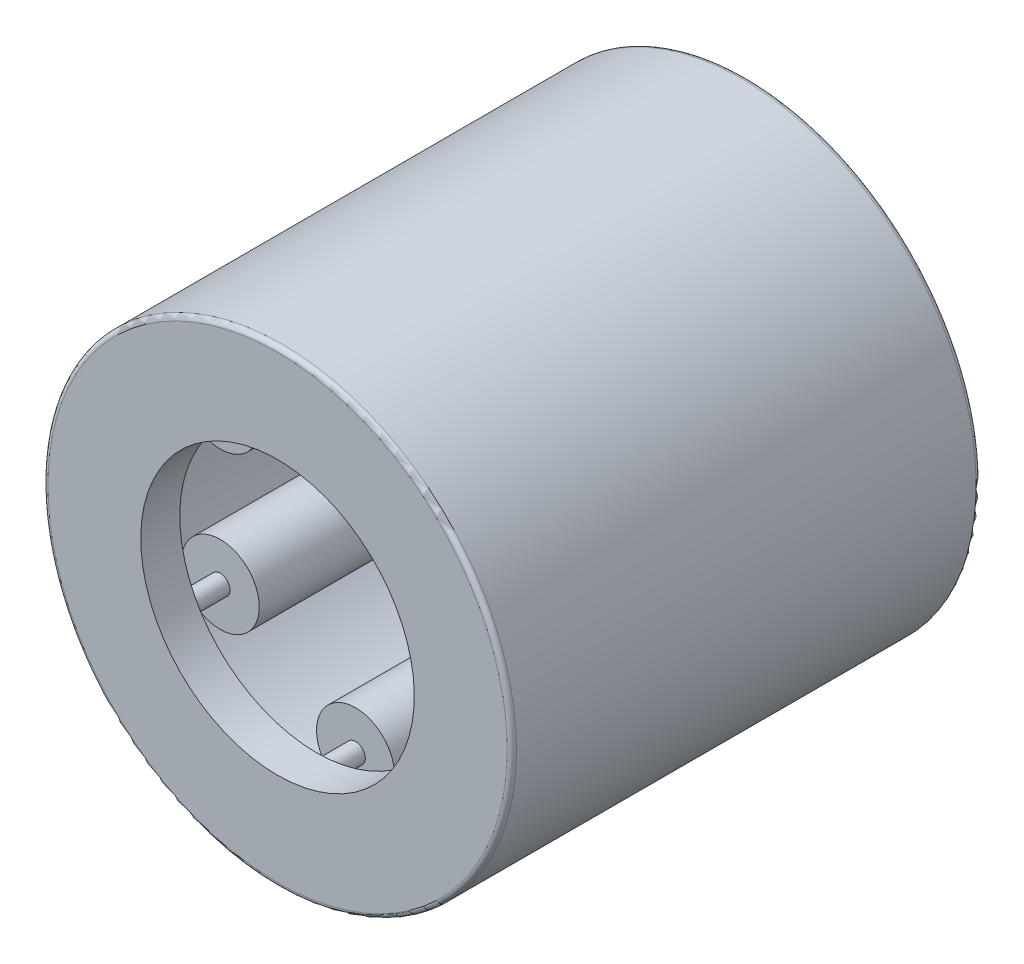
ISO-10303-21;
HEADER;
FILE_DESCRIPTION(('STEP AP214'),'2;1');
FILE_NAME('part.step','',(''),(''),'','','');
FILE_SCHEMA(('AUTOMOTIVE_DESIGN { 1 0 10303 214 1 1 1 1 }'));
ENDSEC;
DATA;
#1=APPLICATION_CONTEXT('core data for automotive mechanical design processes');
#2=APPLICATION_PROTOCOL_DEFINITION('international standard','automotive_design',2000,#1);
#3=PRODUCT_CONTEXT('',#1,'mechanical');
#4=PRODUCT('Part','Part','',(#3));
#5=PRODUCT_RELATED_PRODUCT_CATEGORY('part','',(#4));
#6=PRODUCT_DEFINITION_FORMATION('','',#4);
#7=PRODUCT_DEFINITION_CONTEXT('part definition',#1,'design');
#8=PRODUCT_DEFINITION('design','',#6,#7);
#9=PRODUCT_DEFINITION_SHAPE('','',#8);
#10=(LENGTH_UNIT() NAMED_UNIT(*) SI_UNIT(.MILLI.,.METRE.));
#11=(NAMED_UNIT(*) PLANE_ANGLE_UNIT() SI_UNIT($,.RADIAN.));
#12=(NAMED_UNIT(*) SI_UNIT($,.STERADIAN.) SOLID_ANGLE_UNIT());
#13=UNCERTAINTY_MEASURE_WITH_UNIT(LENGTH_MEASURE(1.E-05),#10,'distance_accuracy_value','');
#14=(GEOMETRIC_REPRESENTATION_CONTEXT(3) GLOBAL_UNCERTAINTY_ASSIGNED_CONTEXT((#13)) GLOBAL_UNIT_ASSIGNED_CONTEXT((#10,
#11,#12)) REPRESENTATION_CONTEXT('',''));
#15=CARTESIAN_POINT('',(0.,0.,0.));
#16=DIRECTION('',(0.,0.,1.));
#17=DIRECTION('',(1.,0.,0.));
#18=AXIS2_PLACEMENT_3D('',#15,#16,#17);
#19=CARTESIAN_POINT('',(-2.88473062000595,1.66550000000003,-2.669));
#20=DIRECTION('',(0.,0.,1.));
#21=DIRECTION('',(0.866025403784433,-0.50000000000001,0.));
#22=AXIS2_PLACEMENT_3D('',#19,#20,#21);
#23=PLANE('',#22);
#24=CARTESIAN_POINT('',(-2.30839071378741,1.33275000000003,-2.669));
#25=DIRECTION('',(0.,0.,1.));
#26=DIRECTION('',(0.866025403784433,-0.50000000000001,0.));
#27=AXIS2_PLACEMENT_3D('',#24,#25,#26);
#28=CIRCLE('',#27,0.6655);
#29=CARTESIAN_POINT('',(-1.73205080756887,1.00000000000002,-2.669));
#30=VERTEX_POINT('',#29);
#31=EDGE_CURVE('E11',#30,#30,#28,.T.);
#32=ORIENTED_EDGE('',*,*,#31,.F.);
#33=EDGE_LOOP('',(#32));
#34=FACE_BOUND('',#33,.T.);
#35=CARTESIAN_POINT('',(-2.30839071378741,1.33275000000003,-2.669));
#36=DIRECTION('',(0.,0.,1.));
#37=DIRECTION('',(0.866025403784433,-0.50000000000001,0.));
#38=AXIS2_PLACEMENT_3D('',#35,#36,#37);
#39=CIRCLE('',#38,0.166374999999998);
#40=CARTESIAN_POINT('',(-2.16430573723277,1.24956250000003,-2.669));
#41=VERTEX_POINT('',#40);
#42=EDGE_CURVE('E56',#41,#41,#39,.T.);
#43=ORIENTED_EDGE('',*,*,#42,.T.);
#44=EDGE_LOOP('',(#43));
#45=FACE_BOUND('',#44,.T.);
#46=ADVANCED_FACE('F42',(#34,#45),#23,.F.);
#47=CARTESIAN_POINT('',(-2.30839071378741,1.33275000000003,2.669));
#48=DIRECTION('',(0.,0.,1.));
#49=DIRECTION('',(0.866025403784433,-0.50000000000001,0.));
#50=AXIS2_PLACEMENT_3D('',#47,#48,#49);
#51=CYLINDRICAL_SURFACE('',#50,0.6655);
#52=CARTESIAN_POINT('',(-2.30839071378741,1.33275000000003,2.669));
#53=DIRECTION('',(0.,0.,1.));
#54=DIRECTION('',(0.866025403784433,-0.50000000000001,0.));
#55=AXIS2_PLACEMENT_3D('',#52,#53,#54);
#56=CIRCLE('',#55,0.6655);
#57=CARTESIAN_POINT('',(-1.73205080756887,1.00000000000002,2.669));
#58=VERTEX_POINT('',#57);
#59=EDGE_CURVE('E48',#58,#58,#56,.T.);
#60=ORIENTED_EDGE('',*,*,#59,.F.);
#61=EDGE_LOOP('',(#60));
#62=FACE_BOUND('',#61,.T.);
#63=ORIENTED_EDGE('',*,*,#31,.T.);
#64=EDGE_LOOP('',(#63));
#65=FACE_BOUND('',#64,.T.);
#66=ADVANCED_FACE('F71',(#62,#65),#51,.T.);
#67=CARTESIAN_POINT('',(-2.88473062000595,1.66550000000003,2.669));
#68=DIRECTION('',(0.,0.,-1.));
#69=DIRECTION('',(-0.866025403784433,0.50000000000001,0.));
#70=AXIS2_PLACEMENT_3D('',#67,#68,#69);
#71=PLANE('',#70);
#72=CARTESIAN_POINT('',(-2.30839071378741,1.33275000000003,2.669));
#73=DIRECTION('',(0.,0.,1.));
#74=DIRECTION('',(0.866025403784433,-0.50000000000001,0.));
#75=AXIS2_PLACEMENT_3D('',#72,#73,#74);
#76=CIRCLE('',#75,0.166374999999998);
#77=CARTESIAN_POINT('',(-2.16430573723277,1.24956250000003,2.669));
#78=VERTEX_POINT('',#77);
#79=EDGE_CURVE('E52',#78,#78,#76,.T.);
#80=ORIENTED_EDGE('',*,*,#79,.F.);
#81=EDGE_LOOP('',(#80));
#82=FACE_BOUND('',#81,.T.);
#83=ORIENTED_EDGE('',*,*,#59,.T.);
#84=EDGE_LOOP('',(#83));
#85=FACE_BOUND('',#84,.T.);
#86=ADVANCED_FACE('F66',(#82,#85),#71,.F.);
#87=CARTESIAN_POINT('',(-2.30839071378741,1.33275000000003,2.669));
#88=DIRECTION('',(0.,0.,1.));
#89=DIRECTION('',(0.866025403784433,-0.50000000000001,0.));
#90=AXIS2_PLACEMENT_3D('',#87,#88,#89);
#91=CYLINDRICAL_SURFACE('',#90,0.166374999999998);
#92=ORIENTED_EDGE('',*,*,#42,.F.);
#93=EDGE_LOOP('',(#92));
#94=FACE_BOUND('',#93,.T.);
#95=ORIENTED_EDGE('',*,*,#79,.T.);
#96=EDGE_LOOP('',(#95));
#97=FACE_BOUND('',#96,.T.);
#98=ADVANCED_FACE('F63',(#94,#97),#91,.F.);
#99=CLOSED_SHELL('',(#46,#66,#86,#98));
#100=MANIFOLD_SOLID_BREP('B2',#99);
#101=CARTESIAN_POINT('',(-2.88473062000598,-1.66549999999997,-2.669));
#102=DIRECTION('',(0.,0.,1.));
#103=DIRECTION('',(0.866025403784443,0.499999999999992,0.));
#104=AXIS2_PLACEMENT_3D('',#101,#102,#103);
#105=PLANE('',#104);
#106=CARTESIAN_POINT('',(-2.30839071378743,-1.33274999999998,-2.669));
#107=DIRECTION('',(0.,0.,1.));
#108=DIRECTION('',(0.866025403784443,0.499999999999992,0.));
#109=AXIS2_PLACEMENT_3D('',#106,#107,#108);
#110=CIRCLE('',#109,0.6655);
#111=CARTESIAN_POINT('',(-1.73205080756889,-0.999999999999984,-2.669));
#112=VERTEX_POINT('',#111);
#113=EDGE_CURVE('E41',#112,#112,#110,.T.);
#114=ORIENTED_EDGE('',*,*,#113,.F.);
#115=EDGE_LOOP('',(#114));
#116=FACE_BOUND('',#115,.T.);
#117=CARTESIAN_POINT('',(-2.30839071378743,-1.33274999999998,-2.669));
#118=DIRECTION('',(0.,0.,1.));
#119=DIRECTION('',(0.866025403784443,0.499999999999992,0.));
#120=AXIS2_PLACEMENT_3D('',#117,#118,#119);
#121=CIRCLE('',#120,0.166374999999998);
#122=CARTESIAN_POINT('',(-2.1643057372328,-1.24956249999998,-2.669));
#123=VERTEX_POINT('',#122);
#124=EDGE_CURVE('E126',#123,#123,#121,.T.);
#125=ORIENTED_EDGE('',*,*,#124,.T.);
#126=EDGE_LOOP('',(#125));
#127=FACE_BOUND('',#126,.T.);
#128=ADVANCED_FACE('F112',(#116,#127),#105,.F.);
#129=CARTESIAN_POINT('',(-2.30839071378743,-1.33274999999998,2.669));
#130=DIRECTION('',(0.,0.,1.));
#131=DIRECTION('',(0.866025403784443,0.499999999999992,0.));
#132=AXIS2_PLACEMENT_3D('',#129,#130,#131);
#133=CYLINDRICAL_SURFACE('',#132,0.6655);
#134=CARTESIAN_POINT('',(-2.30839071378743,-1.33274999999998,2.669));
#135=DIRECTION('',(0.,0.,1.));
#136=DIRECTION('',(0.866025403784443,0.499999999999992,0.));
#137=AXIS2_PLACEMENT_3D('',#134,#135,#136);
#138=CIRCLE('',#137,0.6655);
#139=CARTESIAN_POINT('',(-1.73205080756889,-0.999999999999984,2.669));
#140=VERTEX_POINT('',#139);
#141=EDGE_CURVE('E118',#140,#140,#138,.T.);
#142=ORIENTED_EDGE('',*,*,#141,.F.);
#143=EDGE_LOOP('',(#142));
#144=FACE_BOUND('',#143,.T.);
#145=ORIENTED_EDGE('',*,*,#113,.T.);
#146=EDGE_LOOP('',(#145));
#147=FACE_BOUND('',#146,.T.);
#148=ADVANCED_FACE('F141',(#144,#147),#133,.T.);
#149=CARTESIAN_POINT('',(-2.88473062000598,-1.66549999999997,2.669));
#150=DIRECTION('',(0.,0.,-1.));
#151=DIRECTION('',(-0.866025403784443,-0.499999999999992,0.));
#152=AXIS2_PLACEMENT_3D('',#149,#150,#151);
#153=PLANE('',#152);
#154=CARTESIAN_POINT('',(-2.30839071378743,-1.33274999999998,2.669));
#155=DIRECTION('',(0.,0.,1.));
#156=DIRECTION('',(0.866025403784443,0.499999999999992,0.));
#157=AXIS2_PLACEMENT_3D('',#154,#155,#156);
#158=CIRCLE('',#157,0.166374999999998);
#159=CARTESIAN_POINT('',(-2.1643057372328,-1.24956249999998,2.669));
#160=VERTEX_POINT('',#159);
#161=EDGE_CURVE('E122',#160,#160,#158,.T.);
#162=ORIENTED_EDGE('',*,*,#161,.F.);
#163=EDGE_LOOP('',(#162));
#164=FACE_BOUND('',#163,.T.);
#165=ORIENTED_EDGE('',*,*,#141,.T.);
#166=EDGE_LOOP('',(#165));
#167=FACE_BOUND('',#166,.T.);
#168=ADVANCED_FACE('F136',(#164,#167),#153,.F.);
#169=CARTESIAN_POINT('',(-2.30839071378743,-1.33274999999998,2.669));
#170=DIRECTION('',(0.,0.,1.));
#171=DIRECTION('',(0.866025403784443,0.499999999999992,0.));
#172=AXIS2_PLACEMENT_3D('',#169,#170,#171);
#173=CYLINDRICAL_SURFACE('',#172,0.166374999999998);
#174=ORIENTED_EDGE('',*,*,#124,.F.);
#175=EDGE_LOOP('',(#174));
#176=FACE_BOUND('',#175,.T.);
#177=ORIENTED_EDGE('',*,*,#161,.T.);
#178=EDGE_LOOP('',(#177));
#179=FACE_BOUND('',#178,.T.);
#180=ADVANCED_FACE('F133',(#176,#179),#173,.F.);
#181=CLOSED_SHELL('',(#128,#148,#168,#180));
#182=MANIFOLD_SOLID_BREP('B6',#181);
#183=CARTESIAN_POINT('',(0.,-3.331,-2.669));
#184=DIRECTION('',(0.,0.,1.));
#185=DIRECTION('',(0.,1.,0.));
#186=AXIS2_PLACEMENT_3D('',#183,#184,#185);
#187=PLANE('',#186);
#188=CARTESIAN_POINT('',(0.,-2.6655,-2.669));
#189=DIRECTION('',(0.,0.,1.));
#190=DIRECTION('',(0.,1.,0.));
#191=AXIS2_PLACEMENT_3D('',#188,#189,#190);
#192=CIRCLE('',#191,0.6655);
#193=CARTESIAN_POINT('',(0.,-2.,-2.669));
#194=VERTEX_POINT('',#193);
#195=EDGE_CURVE('E111',#194,#194,#192,.T.);
#196=ORIENTED_EDGE('',*,*,#195,.F.);
#197=EDGE_LOOP('',(#196));
#198=FACE_BOUND('',#197,.T.);
#199=CARTESIAN_POINT('',(0.,-2.6655,-2.669));
#200=DIRECTION('',(0.,0.,1.));
#201=DIRECTION('',(0.,1.,0.));
#202=AXIS2_PLACEMENT_3D('',#199,#200,#201);
#203=CIRCLE('',#202,0.166374999999998);
#204=CARTESIAN_POINT('',(0.,-2.499125,-2.669));
#205=VERTEX_POINT('',#204);
#206=EDGE_CURVE('E196',#205,#205,#203,.T.);
#207=ORIENTED_EDGE('',*,*,#206,.T.);
#208=EDGE_LOOP('',(#207));
#209=FACE_BOUND('',#208,.T.);
#210=ADVANCED_FACE('F182',(#198,#209),#187,.F.);
#211=CARTESIAN_POINT('',(0.,-2.6655,2.669));
#212=DIRECTION('',(0.,0.,1.));
#213=DIRECTION('',(0.,1.,0.));
#214=AXIS2_PLACEMENT_3D('',#211,#212,#213);
#215=CYLINDRICAL_SURFACE('',#214,0.6655);
#216=CARTESIAN_POINT('',(0.,-2.6655,2.669));
#217=DIRECTION('',(0.,0.,1.));
#218=DIRECTION('',(0.,1.,0.));
#219=AXIS2_PLACEMENT_3D('',#216,#217,#218);
#220=CIRCLE('',#219,0.6655);
#221=CARTESIAN_POINT('',(0.,-2.,2.669));
#222=VERTEX_POINT('',#221);
#223=EDGE_CURVE('E188',#222,#222,#220,.T.);
#224=ORIENTED_EDGE('',*,*,#223,.F.);
#225=EDGE_LOOP('',(#224));
#226=FACE_BOUND('',#225,.T.);
#227=ORIENTED_EDGE('',*,*,#195,.T.);
#228=EDGE_LOOP('',(#227));
#229=FACE_BOUND('',#228,.T.);
#230=ADVANCED_FACE('F211',(#226,#229),#215,.T.);
#231=CARTESIAN_POINT('',(0.,-3.331,2.669));
#232=DIRECTION('',(0.,0.,-1.));
#233=DIRECTION('',(0.,-1.,0.));
#234=AXIS2_PLACEMENT_3D('',#231,#232,#233);
#235=PLANE('',#234);
#236=CARTESIAN_POINT('',(0.,-2.6655,2.669));
#237=DIRECTION('',(0.,0.,1.));
#238=DIRECTION('',(0.,1.,0.));
#239=AXIS2_PLACEMENT_3D('',#236,#237,#238);
#240=CIRCLE('',#239,0.166374999999998);
#241=CARTESIAN_POINT('',(0.,-2.499125,2.669));
#242=VERTEX_POINT('',#241);
#243=EDGE_CURVE('E192',#242,#242,#240,.T.);
#244=ORIENTED_EDGE('',*,*,#243,.F.);
#245=EDGE_LOOP('',(#244));
#246=FACE_BOUND('',#245,.T.);
#247=ORIENTED_EDGE('',*,*,#223,.T.);
#248=EDGE_LOOP('',(#247));
#249=FACE_BOUND('',#248,.T.);
#250=ADVANCED_FACE('F206',(#246,#249),#235,.F.);
#251=CARTESIAN_POINT('',(0.,-2.6655,2.669));
#252=DIRECTION('',(0.,0.,1.));
#253=DIRECTION('',(0.,1.,0.));
#254=AXIS2_PLACEMENT_3D('',#251,#252,#253);
#255=CYLINDRICAL_SURFACE('',#254,0.166374999999998);
#256=ORIENTED_EDGE('',*,*,#206,.F.);
#257=EDGE_LOOP('',(#256));
#258=FACE_BOUND('',#257,.T.);
#259=ORIENTED_EDGE('',*,*,#243,.T.);
#260=EDGE_LOOP('',(#259));
#261=FACE_BOUND('',#260,.T.);
#262=ADVANCED_FACE('F203',(#258,#261),#255,.F.);
#263=CLOSED_SHELL('',(#210,#230,#250,#262));
#264=MANIFOLD_SOLID_BREP('B36',#263);
#265=CARTESIAN_POINT('',(2.88473062000596,-1.66550000000001,-2.669));
#266=DIRECTION('',(0.,0.,1.));
#267=DIRECTION('',(-0.866025403784436,0.500000000000004,0.));
#268=AXIS2_PLACEMENT_3D('',#265,#266,#267);
#269=PLANE('',#268);
#270=CARTESIAN_POINT('',(2.30839071378742,-1.33275000000001,-2.669));
#271=DIRECTION('',(0.,0.,1.));
#272=DIRECTION('',(-0.866025403784436,0.500000000000004,0.));
#273=AXIS2_PLACEMENT_3D('',#270,#271,#272);
#274=CIRCLE('',#273,0.6655);
#275=CARTESIAN_POINT('',(1.73205080756887,-1.00000000000001,-2.669));
#276=VERTEX_POINT('',#275);
#277=EDGE_CURVE('E181',#276,#276,#274,.T.);
#278=ORIENTED_EDGE('',*,*,#277,.F.);
#279=EDGE_LOOP('',(#278));
#280=FACE_BOUND('',#279,.T.);
#281=CARTESIAN_POINT('',(2.30839071378742,-1.33275000000001,-2.669));
#282=DIRECTION('',(0.,0.,1.));
#283=DIRECTION('',(-0.866025403784436,0.500000000000004,0.));
#284=AXIS2_PLACEMENT_3D('',#281,#282,#283);
#285=CIRCLE('',#284,0.166374999999998);
#286=CARTESIAN_POINT('',(2.16430573723278,-1.24956250000001,-2.669));
#287=VERTEX_POINT('',#286);
#288=EDGE_CURVE('E266',#287,#287,#285,.T.);
#289=ORIENTED_EDGE('',*,*,#288,.T.);
#290=EDGE_LOOP('',(#289));
#291=FACE_BOUND('',#290,.T.);
#292=ADVANCED_FACE('F252',(#280,#291),#269,.F.);
#293=CARTESIAN_POINT('',(2.30839071378742,-1.33275000000001,2.669));
#294=DIRECTION('',(0.,0.,1.));
#295=DIRECTION('',(-0.866025403784436,0.500000000000004,0.));
#296=AXIS2_PLACEMENT_3D('',#293,#294,#295);
#297=CYLINDRICAL_SURFACE('',#296,0.6655);
#298=CARTESIAN_POINT('',(2.30839071378742,-1.33275000000001,2.669));
#299=DIRECTION('',(0.,0.,1.));
#300=DIRECTION('',(-0.866025403784436,0.500000000000004,0.));
#301=AXIS2_PLACEMENT_3D('',#298,#299,#300);
#302=CIRCLE('',#301,0.6655);
#303=CARTESIAN_POINT('',(1.73205080756887,-1.00000000000001,2.669));
#304=VERTEX_POINT('',#303);
#305=EDGE_CURVE('E258',#304,#304,#302,.T.);
#306=ORIENTED_EDGE('',*,*,#305,.F.);
#307=EDGE_LOOP('',(#306));
#308=FACE_BOUND('',#307,.T.);
#309=ORIENTED_EDGE('',*,*,#277,.T.);
#310=EDGE_LOOP('',(#309));
#311=FACE_BOUND('',#310,.T.);
#312=ADVANCED_FACE('F281',(#308,#311),#297,.T.);
#313=CARTESIAN_POINT('',(2.88473062000596,-1.66550000000001,2.669));
#314=DIRECTION('',(0.,0.,-1.));
#315=DIRECTION('',(0.866025403784436,-0.500000000000004,0.));
#316=AXIS2_PLACEMENT_3D('',#313,#314,#315);
#317=PLANE('',#316);
#318=CARTESIAN_POINT('',(2.30839071378742,-1.33275000000001,2.669));
#319=DIRECTION('',(0.,0.,1.));
#320=DIRECTION('',(-0.866025403784436,0.500000000000004,0.));
#321=AXIS2_PLACEMENT_3D('',#318,#319,#320);
#322=CIRCLE('',#321,0.166374999999998);
#323=CARTESIAN_POINT('',(2.16430573723278,-1.24956250000001,2.669));
#324=VERTEX_POINT('',#323);
#325=EDGE_CURVE('E262',#324,#324,#322,.T.);
#326=ORIENTED_EDGE('',*,*,#325,.F.);
#327=EDGE_LOOP('',(#326));
#328=FACE_BOUND('',#327,.T.);
#329=ORIENTED_EDGE('',*,*,#305,.T.);
#330=EDGE_LOOP('',(#329));
#331=FACE_BOUND('',#330,.T.);
#332=ADVANCED_FACE('F276',(#328,#331),#317,.F.);
#333=CARTESIAN_POINT('',(2.30839071378742,-1.33275000000001,2.669));
#334=DIRECTION('',(0.,0.,1.));
#335=DIRECTION('',(-0.866025403784436,0.500000000000004,0.));
#336=AXIS2_PLACEMENT_3D('',#333,#334,#335);
#337=CYLINDRICAL_SURFACE('',#336,0.166374999999998);
#338=ORIENTED_EDGE('',*,*,#288,.F.);
#339=EDGE_LOOP('',(#338));
#340=FACE_BOUND('',#339,.T.);
#341=ORIENTED_EDGE('',*,*,#325,.T.);
#342=EDGE_LOOP('',(#341));
#343=FACE_BOUND('',#342,.T.);
#344=ADVANCED_FACE('F273',(#340,#343),#337,.F.);
#345=CLOSED_SHELL('',(#292,#312,#332,#344));
#346=MANIFOLD_SOLID_BREP('B106',#345);
#347=CARTESIAN_POINT('',(2.88473062000597,1.66549999999999,-2.669));
#348=DIRECTION('',(0.,0.,1.));
#349=DIRECTION('',(-0.86602540378444,-0.499999999999998,0.));
#350=AXIS2_PLACEMENT_3D('',#347,#348,#349);
#351=PLANE('',#350);
#352=CARTESIAN_POINT('',(2.30839071378742,1.33274999999999,-2.669));
#353=DIRECTION('',(0.,0.,1.));
#354=DIRECTION('',(-0.86602540378444,-0.499999999999998,0.));
#355=AXIS2_PLACEMENT_3D('',#352,#353,#354);
#356=CIRCLE('',#355,0.6655);
#357=CARTESIAN_POINT('',(1.73205080756888,0.999999999999996,-2.669));
#358=VERTEX_POINT('',#357);
#359=EDGE_CURVE('E251',#358,#358,#356,.T.);
#360=ORIENTED_EDGE('',*,*,#359,.F.);
#361=EDGE_LOOP('',(#360));
#362=FACE_BOUND('',#361,.T.);
#363=CARTESIAN_POINT('',(2.30839071378742,1.33274999999999,-2.669));
#364=DIRECTION('',(0.,0.,1.));
#365=DIRECTION('',(-0.86602540378444,-0.499999999999998,0.));
#366=AXIS2_PLACEMENT_3D('',#363,#364,#365);
#367=CIRCLE('',#366,0.166374999999998);
#368=CARTESIAN_POINT('',(2.16430573723279,1.2495625,-2.669));
#369=VERTEX_POINT('',#368);
#370=EDGE_CURVE('E336',#369,#369,#367,.T.);
#371=ORIENTED_EDGE('',*,*,#370,.T.);
#372=EDGE_LOOP('',(#371));
#373=FACE_BOUND('',#372,.T.);
#374=ADVANCED_FACE('F322',(#362,#373),#351,.F.);
#375=CARTESIAN_POINT('',(2.30839071378742,1.33274999999999,2.669));
#376=DIRECTION('',(0.,0.,1.));
#377=DIRECTION('',(-0.86602540378444,-0.499999999999998,0.));
#378=AXIS2_PLACEMENT_3D('',#375,#376,#377);
#379=CYLINDRICAL_SURFACE('',#378,0.6655);
#380=CARTESIAN_POINT('',(2.30839071378742,1.33274999999999,2.669));
#381=DIRECTION('',(0.,0.,1.));
#382=DIRECTION('',(-0.86602540378444,-0.499999999999998,0.));
#383=AXIS2_PLACEMENT_3D('',#380,#381,#382);
#384=CIRCLE('',#383,0.6655);
#385=CARTESIAN_POINT('',(1.73205080756888,0.999999999999996,2.669));
#386=VERTEX_POINT('',#385);
#387=EDGE_CURVE('E328',#386,#386,#384,.T.);
#388=ORIENTED_EDGE('',*,*,#387,.F.);
#389=EDGE_LOOP('',(#388));
#390=FACE_BOUND('',#389,.T.);
#391=ORIENTED_EDGE('',*,*,#359,.T.);
#392=EDGE_LOOP('',(#391));
#393=FACE_BOUND('',#392,.T.);
#394=ADVANCED_FACE('F351',(#390,#393),#379,.T.);
#395=CARTESIAN_POINT('',(2.88473062000597,1.66549999999999,2.669));
#396=DIRECTION('',(0.,0.,-1.));
#397=DIRECTION('',(0.86602540378444,0.499999999999998,0.));
#398=AXIS2_PLACEMENT_3D('',#395,#396,#397);
#399=PLANE('',#398);
#400=CARTESIAN_POINT('',(2.30839071378742,1.33274999999999,2.669));
#401=DIRECTION('',(0.,0.,1.));
#402=DIRECTION('',(-0.86602540378444,-0.499999999999998,0.));
#403=AXIS2_PLACEMENT_3D('',#400,#401,#402);
#404=CIRCLE('',#403,0.166374999999998);
#405=CARTESIAN_POINT('',(2.16430573723279,1.2495625,2.669));
#406=VERTEX_POINT('',#405);
#407=EDGE_CURVE('E332',#406,#406,#404,.T.);
#408=ORIENTED_EDGE('',*,*,#407,.F.);
#409=EDGE_LOOP('',(#408));
#410=FACE_BOUND('',#409,.T.);
#411=ORIENTED_EDGE('',*,*,#387,.T.);
#412=EDGE_LOOP('',(#411));
#413=FACE_BOUND('',#412,.T.);
#414=ADVANCED_FACE('F346',(#410,#413),#399,.F.);
#415=CARTESIAN_POINT('',(2.30839071378742,1.33274999999999,2.669));
#416=DIRECTION('',(0.,0.,1.));
#417=DIRECTION('',(-0.86602540378444,-0.499999999999998,0.));
#418=AXIS2_PLACEMENT_3D('',#415,#416,#417);
#419=CYLINDRICAL_SURFACE('',#418,0.166374999999998);
#420=ORIENTED_EDGE('',*,*,#370,.F.);
#421=EDGE_LOOP('',(#420));
#422=FACE_BOUND('',#421,.T.);
#423=ORIENTED_EDGE('',*,*,#407,.T.);
#424=EDGE_LOOP('',(#423));
#425=FACE_BOUND('',#424,.T.);
#426=ADVANCED_FACE('F343',(#422,#425),#419,.F.);
#427=CLOSED_SHELL('',(#374,#394,#414,#426));
#428=MANIFOLD_SOLID_BREP('B176',#427);
#429=CARTESIAN_POINT('',(-2.30839071378741,1.33275000000003,3.3345));
#430=DIRECTION('',(0.,0.,-1.));
#431=DIRECTION('',(-0.866025403784433,0.50000000000001,0.));
#432=AXIS2_PLACEMENT_3D('',#429,#430,#431);
#433=PLANE('',#432);
#434=CARTESIAN_POINT('',(-2.30839071378741,1.33275000000003,3.3345));
#435=DIRECTION('',(0.,0.,1.));
#436=DIRECTION('',(0.866025403784433,-0.50000000000001,0.));
#437=AXIS2_PLACEMENT_3D('',#434,#435,#436);
#438=CIRCLE('',#437,0.166374999999999);
#439=CARTESIAN_POINT('',(-2.16430573723277,1.24956250000003,3.3345));
#440=VERTEX_POINT('',#439);
#441=EDGE_CURVE('E321',#440,#440,#438,.T.);
#442=ORIENTED_EDGE('',*,*,#441,.T.);
#443=EDGE_LOOP('',(#442));
#444=FACE_BOUND('',#443,.T.);
#445=ADVANCED_FACE('F392',(#444),#433,.F.);
#446=CARTESIAN_POINT('',(-2.30839071378741,1.33275000000003,3.3345));
#447=DIRECTION('',(0.,0.,1.));
#448=DIRECTION('',(0.866025403784433,-0.50000000000001,0.));
#449=AXIS2_PLACEMENT_3D('',#446,#447,#448);
#450=CYLINDRICAL_SURFACE('',#449,0.166374999999999);
#451=ORIENTED_EDGE('',*,*,#441,.F.);
#452=EDGE_LOOP('',(#451));
#453=FACE_BOUND('',#452,.T.);
#454=CARTESIAN_POINT('',(-2.3083907137874,1.33275000000003,-3.3345));
#455=DIRECTION('',(0.,0.,1.));
#456=DIRECTION('',(0.866025403784433,-0.50000000000001,0.));
#457=AXIS2_PLACEMENT_3D('',#454,#455,#456);
#458=CIRCLE('',#457,0.166375);
#459=CARTESIAN_POINT('',(-2.16430573723277,1.24956250000003,-3.3345));
#460=VERTEX_POINT('',#459);
#461=EDGE_CURVE('E398',#460,#460,#458,.T.);
#462=ORIENTED_EDGE('',*,*,#461,.T.);
#463=EDGE_LOOP('',(#462));
#464=FACE_BOUND('',#463,.T.);
#465=ADVANCED_FACE('F404',(#453,#464),#450,.T.);
#466=CARTESIAN_POINT('',(-2.3083907137874,1.33275000000003,-3.3345));
#467=DIRECTION('',(0.,0.,1.));
#468=DIRECTION('',(0.866025403784433,-0.50000000000001,0.));
#469=AXIS2_PLACEMENT_3D('',#466,#467,#468);
#470=PLANE('',#469);
#471=ORIENTED_EDGE('',*,*,#461,.F.);
#472=EDGE_LOOP('',(#471));
#473=FACE_BOUND('',#472,.T.);
#474=ADVANCED_FACE('F406',(#473),#470,.F.);
#475=CLOSED_SHELL('',(#445,#465,#474));
#476=MANIFOLD_SOLID_BREP('B246',#475);
#477=CARTESIAN_POINT('',(-2.30839071378743,-1.33274999999998,3.3345));
#478=DIRECTION('',(0.,0.,-1.));
#479=DIRECTION('',(-0.866025403784443,-0.499999999999992,0.));
#480=AXIS2_PLACEMENT_3D('',#477,#478,#479);
#481=PLANE('',#480);
#482=CARTESIAN_POINT('',(-2.30839071378743,-1.33274999999998,3.3345));
#483=DIRECTION('',(0.,0.,1.));
#484=DIRECTION('',(0.866025403784443,0.499999999999992,0.));
#485=AXIS2_PLACEMENT_3D('',#482,#483,#484);
#486=CIRCLE('',#485,0.166374999999999);
#487=CARTESIAN_POINT('',(-2.1643057372328,-1.24956249999998,3.3345));
#488=VERTEX_POINT('',#487);
#489=EDGE_CURVE('E391',#488,#488,#486,.T.);
#490=ORIENTED_EDGE('',*,*,#489,.T.);
#491=EDGE_LOOP('',(#490));
#492=FACE_BOUND('',#491,.T.);
#493=ADVANCED_FACE('F441',(#492),#481,.F.);
#494=CARTESIAN_POINT('',(-2.30839071378743,-1.33274999999998,3.3345));
#495=DIRECTION('',(0.,0.,1.));
#496=DIRECTION('',(0.866025403784443,0.499999999999992,0.));
#497=AXIS2_PLACEMENT_3D('',#494,#495,#496);
#498=CYLINDRICAL_SURFACE('',#497,0.166374999999999);
#499=ORIENTED_EDGE('',*,*,#489,.F.);
#500=EDGE_LOOP('',(#499));
#501=FACE_BOUND('',#500,.T.);
#502=CARTESIAN_POINT('',(-2.30839071378743,-1.33274999999998,-3.3345));
#503=DIRECTION('',(0.,0.,1.));
#504=DIRECTION('',(0.866025403784443,0.499999999999992,0.));
#505=AXIS2_PLACEMENT_3D('',#502,#503,#504);
#506=CIRCLE('',#505,0.166375);
#507=CARTESIAN_POINT('',(-2.1643057372328,-1.24956249999998,-3.3345));
#508=VERTEX_POINT('',#507);
#509=EDGE_CURVE('E447',#508,#508,#506,.T.);
#510=ORIENTED_EDGE('',*,*,#509,.T.);
#511=EDGE_LOOP('',(#510));
#512=FACE_BOUND('',#511,.T.);
#513=ADVANCED_FACE('F453',(#501,#512),#498,.T.);
#514=CARTESIAN_POINT('',(-2.30839071378743,-1.33274999999998,-3.3345));
#515=DIRECTION('',(0.,0.,1.));
#516=DIRECTION('',(0.866025403784443,0.499999999999992,0.));
#517=AXIS2_PLACEMENT_3D('',#514,#515,#516);
#518=PLANE('',#517);
#519=ORIENTED_EDGE('',*,*,#509,.F.);
#520=EDGE_LOOP('',(#519));
#521=FACE_BOUND('',#520,.T.);
#522=ADVANCED_FACE('F455',(#521),#518,.F.);
#523=CLOSED_SHELL('',(#493,#513,#522));
#524=MANIFOLD_SOLID_BREP('B316',#523);
#525=CARTESIAN_POINT('',(0.,-2.6655,3.3345));
#526=DIRECTION('',(0.,0.,-1.));
#527=DIRECTION('',(0.,-1.,0.));
#528=AXIS2_PLACEMENT_3D('',#525,#526,#527);
#529=PLANE('',#528);
#530=CARTESIAN_POINT('',(0.,-2.6655,3.3345));
#531=DIRECTION('',(0.,0.,1.));
#532=DIRECTION('',(0.,1.,0.));
#533=AXIS2_PLACEMENT_3D('',#530,#531,#532);
#534=CIRCLE('',#533,0.166374999999999);
#535=CARTESIAN_POINT('',(0.,-2.499125,3.3345));
#536=VERTEX_POINT('',#535);
#537=EDGE_CURVE('E440',#536,#536,#534,.T.);
#538=ORIENTED_EDGE('',*,*,#537,.T.);
#539=EDGE_LOOP('',(#538));
#540=FACE_BOUND('',#539,.T.);
#541=ADVANCED_FACE('F490',(#540),#529,.F.);
#542=CARTESIAN_POINT('',(0.,-2.6655,3.3345));
#543=DIRECTION('',(0.,0.,1.));
#544=DIRECTION('',(0.,1.,0.));
#545=AXIS2_PLACEMENT_3D('',#542,#543,#544);
#546=CYLINDRICAL_SURFACE('',#545,0.166374999999999);
#547=ORIENTED_EDGE('',*,*,#537,.F.);
#548=EDGE_LOOP('',(#547));
#549=FACE_BOUND('',#548,.T.);
#550=CARTESIAN_POINT('',(0.,-2.6655,-3.3345));
#551=DIRECTION('',(0.,0.,1.));
#552=DIRECTION('',(0.,1.,0.));
#553=AXIS2_PLACEMENT_3D('',#550,#551,#552);
#554=CIRCLE('',#553,0.166375);
#555=CARTESIAN_POINT('',(0.,-2.499125,-3.3345));
#556=VERTEX_POINT('',#555);
#557=EDGE_CURVE('E496',#556,#556,#554,.T.);
#558=ORIENTED_EDGE('',*,*,#557,.T.);
#559=EDGE_LOOP('',(#558));
#560=FACE_BOUND('',#559,.T.);
#561=ADVANCED_FACE('F502',(#549,#560),#546,.T.);
#562=CARTESIAN_POINT('',(0.,-2.6655,-3.3345));
#563=DIRECTION('',(0.,0.,1.));
#564=DIRECTION('',(0.,1.,0.));
#565=AXIS2_PLACEMENT_3D('',#562,#563,#564);
#566=PLANE('',#565);
#567=ORIENTED_EDGE('',*,*,#557,.F.);
#568=EDGE_LOOP('',(#567));
#569=FACE_BOUND('',#568,.T.);
#570=ADVANCED_FACE('F504',(#569),#566,.F.);
#571=CLOSED_SHELL('',(#541,#561,#570));
#572=MANIFOLD_SOLID_BREP('B386',#571);
#573=CARTESIAN_POINT('',(2.30839071378742,-1.33275000000001,3.3345));
#574=DIRECTION('',(0.,0.,-1.));
#575=DIRECTION('',(0.866025403784436,-0.500000000000004,0.));
#576=AXIS2_PLACEMENT_3D('',#573,#574,#575);
#577=PLANE('',#576);
#578=CARTESIAN_POINT('',(2.30839071378742,-1.33275000000001,3.3345));
#579=DIRECTION('',(0.,0.,1.));
#580=DIRECTION('',(-0.866025403784436,0.500000000000004,0.));
#581=AXIS2_PLACEMENT_3D('',#578,#579,#580);
#582=CIRCLE('',#581,0.166374999999999);
#583=CARTESIAN_POINT('',(2.16430573723278,-1.24956250000001,3.3345));
#584=VERTEX_POINT('',#583);
#585=EDGE_CURVE('E489',#584,#584,#582,.T.);
#586=ORIENTED_EDGE('',*,*,#585,.T.);
#587=EDGE_LOOP('',(#586));
#588=FACE_BOUND('',#587,.T.);
#589=ADVANCED_FACE('F539',(#588),#577,.F.);
#590=CARTESIAN_POINT('',(2.30839071378742,-1.33275000000001,3.3345));
#591=DIRECTION('',(0.,0.,1.));
#592=DIRECTION('',(-0.866025403784436,0.500000000000004,0.));
#593=AXIS2_PLACEMENT_3D('',#590,#591,#592);
#594=CYLINDRICAL_SURFACE('',#593,0.166374999999999);
#595=ORIENTED_EDGE('',*,*,#585,.F.);
#596=EDGE_LOOP('',(#595));
#597=FACE_BOUND('',#596,.T.);
#598=CARTESIAN_POINT('',(2.30839071378742,-1.33275000000001,-3.3345));
#599=DIRECTION('',(0.,0.,1.));
#600=DIRECTION('',(-0.866025403784436,0.500000000000004,0.));
#601=AXIS2_PLACEMENT_3D('',#598,#599,#600);
#602=CIRCLE('',#601,0.166375);
#603=CARTESIAN_POINT('',(2.16430573723278,-1.24956250000001,-3.3345));
#604=VERTEX_POINT('',#603);
#605=EDGE_CURVE('E545',#604,#604,#602,.T.);
#606=ORIENTED_EDGE('',*,*,#605,.T.);
#607=EDGE_LOOP('',(#606));
#608=FACE_BOUND('',#607,.T.);
#609=ADVANCED_FACE('F551',(#597,#608),#594,.T.);
#610=CARTESIAN_POINT('',(2.30839071378742,-1.33275000000001,-3.3345));
#611=DIRECTION('',(0.,0.,1.));
#612=DIRECTION('',(-0.866025403784436,0.500000000000004,0.));
#613=AXIS2_PLACEMENT_3D('',#610,#611,#612);
#614=PLANE('',#613);
#615=ORIENTED_EDGE('',*,*,#605,.F.);
#616=EDGE_LOOP('',(#615));
#617=FACE_BOUND('',#616,.T.);
#618=ADVANCED_FACE('F553',(#617),#614,.F.);
#619=CLOSED_SHELL('',(#589,#609,#618));
#620=MANIFOLD_SOLID_BREP('B435',#619);
#621=CARTESIAN_POINT('',(2.30839071378742,1.33274999999999,3.3345));
#622=DIRECTION('',(0.,0.,-1.));
#623=DIRECTION('',(0.86602540378444,0.499999999999998,0.));
#624=AXIS2_PLACEMENT_3D('',#621,#622,#623);
#625=PLANE('',#624);
#626=CARTESIAN_POINT('',(2.30839071378742,1.33274999999999,3.3345));
#627=DIRECTION('',(0.,0.,1.));
#628=DIRECTION('',(-0.86602540378444,-0.499999999999998,0.));
#629=AXIS2_PLACEMENT_3D('',#626,#627,#628);
#630=CIRCLE('',#629,0.166374999999999);
#631=CARTESIAN_POINT('',(2.16430573723279,1.2495625,3.3345));
#632=VERTEX_POINT('',#631);
#633=EDGE_CURVE('E538',#632,#632,#630,.T.);
#634=ORIENTED_EDGE('',*,*,#633,.T.);
#635=EDGE_LOOP('',(#634));
#636=FACE_BOUND('',#635,.T.);
#637=ADVANCED_FACE('F588',(#636),#625,.F.);
#638=CARTESIAN_POINT('',(2.30839071378742,1.33274999999999,3.3345));
#639=DIRECTION('',(0.,0.,1.));
#640=DIRECTION('',(-0.86602540378444,-0.499999999999998,0.));
#641=AXIS2_PLACEMENT_3D('',#638,#639,#640);
#642=CYLINDRICAL_SURFACE('',#641,0.166374999999999);
#643=ORIENTED_EDGE('',*,*,#633,.F.);
#644=EDGE_LOOP('',(#643));
#645=FACE_BOUND('',#644,.T.);
#646=CARTESIAN_POINT('',(2.30839071378742,1.33274999999999,-3.3345));
#647=DIRECTION('',(0.,0.,1.));
#648=DIRECTION('',(-0.86602540378444,-0.499999999999998,0.));
#649=AXIS2_PLACEMENT_3D('',#646,#647,#648);
#650=CIRCLE('',#649,0.166375);
#651=CARTESIAN_POINT('',(2.16430573723279,1.24956249999999,-3.3345));
#652=VERTEX_POINT('',#651);
#653=EDGE_CURVE('E594',#652,#652,#650,.T.);
#654=ORIENTED_EDGE('',*,*,#653,.T.);
#655=EDGE_LOOP('',(#654));
#656=FACE_BOUND('',#655,.T.);
#657=ADVANCED_FACE('F600',(#645,#656),#642,.T.);
#658=CARTESIAN_POINT('',(2.30839071378742,1.33274999999999,-3.3345));
#659=DIRECTION('',(0.,0.,1.));
#660=DIRECTION('',(-0.86602540378444,-0.499999999999998,0.));
#661=AXIS2_PLACEMENT_3D('',#658,#659,#660);
#662=PLANE('',#661);
#663=ORIENTED_EDGE('',*,*,#653,.F.);
#664=EDGE_LOOP('',(#663));
#665=FACE_BOUND('',#664,.T.);
#666=ADVANCED_FACE('F602',(#665),#662,.F.);
#667=CLOSED_SHELL('',(#637,#657,#666));
#668=MANIFOLD_SOLID_BREP('B484',#667);
#669=CARTESIAN_POINT('',(0.,2.6655,3.3345));
#670=DIRECTION('',(0.,0.,-1.));
#671=DIRECTION('',(0.,1.,0.));
#672=AXIS2_PLACEMENT_3D('',#669,#670,#671);
#673=PLANE('',#672);
#674=CARTESIAN_POINT('',(0.,2.6655,3.3345));
#675=DIRECTION('',(0.,0.,1.));
#676=DIRECTION('',(0.,-1.,0.));
#677=AXIS2_PLACEMENT_3D('',#674,#675,#676);
#678=CIRCLE('',#677,0.166374999999999);
#679=CARTESIAN_POINT('',(0.,2.499125,3.3345));
#680=VERTEX_POINT('',#679);
#681=EDGE_CURVE('E587',#680,#680,#678,.T.);
#682=ORIENTED_EDGE('',*,*,#681,.T.);
#683=EDGE_LOOP('',(#682));
#684=FACE_BOUND('',#683,.T.);
#685=ADVANCED_FACE('F637',(#684),#673,.F.);
#686=CARTESIAN_POINT('',(0.,2.6655,3.3345));
#687=DIRECTION('',(0.,0.,1.));
#688=DIRECTION('',(0.,-1.,0.));
#689=AXIS2_PLACEMENT_3D('',#686,#687,#688);
#690=CYLINDRICAL_SURFACE('',#689,0.166374999999999);
#691=ORIENTED_EDGE('',*,*,#681,.F.);
#692=EDGE_LOOP('',(#691));
#693=FACE_BOUND('',#692,.T.);
#694=CARTESIAN_POINT('',(0.,2.6655,-3.3345));
#695=DIRECTION('',(0.,0.,1.));
#696=DIRECTION('',(0.,-1.,0.));
#697=AXIS2_PLACEMENT_3D('',#694,#695,#696);
#698=CIRCLE('',#697,0.166375);
#699=CARTESIAN_POINT('',(0.,2.499125,-3.3345));
#700=VERTEX_POINT('',#699);
#701=EDGE_CURVE('E643',#700,#700,#698,.T.);
#702=ORIENTED_EDGE('',*,*,#701,.T.);
#703=EDGE_LOOP('',(#702));
#704=FACE_BOUND('',#703,.T.);
#705=ADVANCED_FACE('F649',(#693,#704),#690,.T.);
#706=CARTESIAN_POINT('',(0.,2.6655,-3.3345));
#707=DIRECTION('',(0.,0.,1.));
#708=DIRECTION('',(0.,-1.,0.));
#709=AXIS2_PLACEMENT_3D('',#706,#707,#708);
#710=PLANE('',#709);
#711=ORIENTED_EDGE('',*,*,#701,.F.);
#712=EDGE_LOOP('',(#711));
#713=FACE_BOUND('',#712,.T.);
#714=ADVANCED_FACE('F651',(#713),#710,.F.);
#715=CLOSED_SHELL('',(#685,#705,#714));
#716=MANIFOLD_SOLID_BREP('B533',#715);
#717=CARTESIAN_POINT('',(0.,3.331,-2.669));
#718=DIRECTION('',(0.,0.,1.));
#719=DIRECTION('',(0.,-1.,0.));
#720=AXIS2_PLACEMENT_3D('',#717,#718,#719);
#721=PLANE('',#720);
#722=CARTESIAN_POINT('',(0.,2.6655,-2.669));
#723=DIRECTION('',(0.,0.,1.));
#724=DIRECTION('',(0.,-1.,0.));
#725=AXIS2_PLACEMENT_3D('',#722,#723,#724);
#726=CIRCLE('',#725,0.6655);
#727=CARTESIAN_POINT('',(0.,2.,-2.669));
#728=VERTEX_POINT('',#727);
#729=EDGE_CURVE('E636',#728,#728,#726,.T.);
#730=ORIENTED_EDGE('',*,*,#729,.F.);
#731=EDGE_LOOP('',(#730));
#732=FACE_BOUND('',#731,.T.);
#733=CARTESIAN_POINT('',(0.,2.6655,-2.669));
#734=DIRECTION('',(0.,0.,1.));
#735=DIRECTION('',(0.,-1.,0.));
#736=AXIS2_PLACEMENT_3D('',#733,#734,#735);
#737=CIRCLE('',#736,0.166374999999998);
#738=CARTESIAN_POINT('',(0.,2.499125,-2.669));
#739=VERTEX_POINT('',#738);
#740=EDGE_CURVE('E699',#739,#739,#737,.T.);
#741=ORIENTED_EDGE('',*,*,#740,.T.);
#742=EDGE_LOOP('',(#741));
#743=FACE_BOUND('',#742,.T.);
#744=ADVANCED_FACE('F685',(#732,#743),#721,.F.);
#745=CARTESIAN_POINT('',(0.,2.6655,2.669));
#746=DIRECTION('',(0.,0.,1.));
#747=DIRECTION('',(0.,-1.,0.));
#748=AXIS2_PLACEMENT_3D('',#745,#746,#747);
#749=CYLINDRICAL_SURFACE('',#748,0.6655);
#750=CARTESIAN_POINT('',(0.,2.6655,2.669));
#751=DIRECTION('',(0.,0.,1.));
#752=DIRECTION('',(0.,-1.,0.));
#753=AXIS2_PLACEMENT_3D('',#750,#751,#752);
#754=CIRCLE('',#753,0.6655);
#755=CARTESIAN_POINT('',(0.,2.,2.669));
#756=VERTEX_POINT('',#755);
#757=EDGE_CURVE('E691',#756,#756,#754,.T.);
#758=ORIENTED_EDGE('',*,*,#757,.F.);
#759=EDGE_LOOP('',(#758));
#760=FACE_BOUND('',#759,.T.);
#761=ORIENTED_EDGE('',*,*,#729,.T.);
#762=EDGE_LOOP('',(#761));
#763=FACE_BOUND('',#762,.T.);
#764=ADVANCED_FACE('F714',(#760,#763),#749,.T.);
#765=CARTESIAN_POINT('',(0.,3.331,2.669));
#766=DIRECTION('',(0.,0.,-1.));
#767=DIRECTION('',(0.,1.,0.));
#768=AXIS2_PLACEMENT_3D('',#765,#766,#767);
#769=PLANE('',#768);
#770=CARTESIAN_POINT('',(0.,2.6655,2.669));
#771=DIRECTION('',(0.,0.,1.));
#772=DIRECTION('',(0.,-1.,0.));
#773=AXIS2_PLACEMENT_3D('',#770,#771,#772);
#774=CIRCLE('',#773,0.166374999999998);
#775=CARTESIAN_POINT('',(0.,2.499125,2.669));
#776=VERTEX_POINT('',#775);
#777=EDGE_CURVE('E695',#776,#776,#774,.T.);
#778=ORIENTED_EDGE('',*,*,#777,.F.);
#779=EDGE_LOOP('',(#778));
#780=FACE_BOUND('',#779,.T.);
#781=ORIENTED_EDGE('',*,*,#757,.T.);
#782=EDGE_LOOP('',(#781));
#783=FACE_BOUND('',#782,.T.);
#784=ADVANCED_FACE('F709',(#780,#783),#769,.F.);
#785=CARTESIAN_POINT('',(0.,2.6655,2.669));
#786=DIRECTION('',(0.,0.,1.));
#787=DIRECTION('',(0.,-1.,0.));
#788=AXIS2_PLACEMENT_3D('',#785,#786,#787);
#789=CYLINDRICAL_SURFACE('',#788,0.166374999999998);
#790=ORIENTED_EDGE('',*,*,#740,.F.);
#791=EDGE_LOOP('',(#790));
#792=FACE_BOUND('',#791,.T.);
#793=ORIENTED_EDGE('',*,*,#777,.T.);
#794=EDGE_LOOP('',(#793));
#795=FACE_BOUND('',#794,.T.);
#796=ADVANCED_FACE('F706',(#792,#795),#789,.F.);
#797=CLOSED_SHELL('',(#744,#764,#784,#796));
#798=MANIFOLD_SOLID_BREP('B582',#797);
#799=CARTESIAN_POINT('',(0.,3.9965,4.));
#800=DIRECTION('',(0.,0.,-1.));
#801=DIRECTION('',(0.,1.,0.));
#802=AXIS2_PLACEMENT_3D('',#799,#800,#801);
#803=PLANE('',#802);
#804=CARTESIAN_POINT('',(0.,0.,4.));
#805=DIRECTION('',(0.,0.,-1.));
#806=DIRECTION('',(0.,1.,0.));
#807=AXIS2_PLACEMENT_3D('',#804,#805,#806);
#808=CIRCLE('',#807,3.91657);
#809=CARTESIAN_POINT('',(0.,3.91657,4.));
#810=VERTEX_POINT('',#809);
#811=EDGE_CURVE('E684',#810,#810,#808,.F.);
#812=ORIENTED_EDGE('',*,*,#811,.T.);
#813=EDGE_LOOP('',(#812));
#814=FACE_BOUND('',#813,.T.);
#815=CARTESIAN_POINT('',(0.,0.,4.));
#816=DIRECTION('',(0.,0.,1.));
#817=DIRECTION('',(0.,-1.,0.));
#818=AXIS2_PLACEMENT_3D('',#815,#816,#817);
#819=CIRCLE('',#818,2.33275);
#820=CARTESIAN_POINT('',(0.,-2.33274999999999,4.));
#821=VERTEX_POINT('',#820);
#822=EDGE_CURVE('E767',#821,#821,#819,.T.);
#823=ORIENTED_EDGE('',*,*,#822,.F.);
#824=EDGE_LOOP('',(#823));
#825=FACE_BOUND('',#824,.T.);
#826=ADVANCED_FACE('F747',(#814,#825),#803,.F.);
#827=CARTESIAN_POINT('',(0.,0.,4.));
#828=DIRECTION('',(0.,0.,1.));
#829=DIRECTION('',(0.,-1.,0.));
#830=AXIS2_PLACEMENT_3D('',#827,#828,#829);
#831=CYLINDRICAL_SURFACE('',#830,2.33275);
#832=CARTESIAN_POINT('',(0.,0.,3.3345));
#833=DIRECTION('',(0.,0.,1.));
#834=DIRECTION('',(0.,-1.,0.));
#835=AXIS2_PLACEMENT_3D('',#832,#833,#834);
#836=CIRCLE('',#835,2.33275);
#837=CARTESIAN_POINT('',(0.,-2.33274999999999,3.3345));
#838=VERTEX_POINT('',#837);
#839=EDGE_CURVE('E770',#838,#838,#836,.T.);
#840=ORIENTED_EDGE('',*,*,#839,.F.);
#841=EDGE_LOOP('',(#840));
#842=FACE_BOUND('',#841,.T.);
#843=ORIENTED_EDGE('',*,*,#822,.T.);
#844=EDGE_LOOP('',(#843));
#845=FACE_BOUND('',#844,.T.);
#846=ADVANCED_FACE('F809',(#842,#845),#831,.F.);
#847=CARTESIAN_POINT('',(0.,2.33275,3.3345));
#848=DIRECTION('',(0.,0.,1.));
#849=DIRECTION('',(0.,-1.,0.));
#850=AXIS2_PLACEMENT_3D('',#847,#848,#849);
#851=PLANE('',#850);
#852=CARTESIAN_POINT('',(0.,0.,3.3345));
#853=DIRECTION('',(0.,0.,1.));
#854=DIRECTION('',(0.,-1.,0.));
#855=AXIS2_PLACEMENT_3D('',#852,#853,#854);
#856=CIRCLE('',#855,3.331);
#857=CARTESIAN_POINT('',(0.,-3.33099999999999,3.3345));
#858=VERTEX_POINT('',#857);
#859=EDGE_CURVE('E773',#858,#858,#856,.T.);
#860=ORIENTED_EDGE('',*,*,#859,.F.);
#861=EDGE_LOOP('',(#860));
#862=FACE_BOUND('',#861,.T.);
#863=ORIENTED_EDGE('',*,*,#839,.T.);
#864=EDGE_LOOP('',(#863));
#865=FACE_BOUND('',#864,.T.);
#866=ADVANCED_FACE('F803',(#862,#865),#851,.F.);
#867=CARTESIAN_POINT('',(0.,0.,4.));
#868=DIRECTION('',(0.,0.,1.));
#869=DIRECTION('',(0.,-1.,0.));
#870=AXIS2_PLACEMENT_3D('',#867,#868,#869);
#871=CYLINDRICAL_SURFACE('',#870,3.331);
#872=CARTESIAN_POINT('',(0.,0.,-3.3345));
#873=DIRECTION('',(0.,0.,1.));
#874=DIRECTION('',(0.,-1.,0.));
#875=AXIS2_PLACEMENT_3D('',#872,#873,#874);
#876=CIRCLE('',#875,3.331);
#877=CARTESIAN_POINT('',(0.,-3.331,-3.3345));
#878=VERTEX_POINT('',#877);
#879=EDGE_CURVE('E776',#878,#878,#876,.T.);
#880=ORIENTED_EDGE('',*,*,#879,.F.);
#881=EDGE_LOOP('',(#880));
#882=FACE_BOUND('',#881,.T.);
#883=ORIENTED_EDGE('',*,*,#859,.T.);
#884=EDGE_LOOP('',(#883));
#885=FACE_BOUND('',#884,.T.);
#886=ADVANCED_FACE('F797',(#882,#885),#871,.F.);
#887=CARTESIAN_POINT('',(0.,3.331,-3.3345));
#888=DIRECTION('',(0.,0.,-1.));
#889=DIRECTION('',(0.,1.,0.));
#890=AXIS2_PLACEMENT_3D('',#887,#888,#889);
#891=PLANE('',#890);
#892=CARTESIAN_POINT('',(0.,0.,-3.3345));
#893=DIRECTION('',(0.,0.,1.));
#894=DIRECTION('',(0.,-1.,0.));
#895=AXIS2_PLACEMENT_3D('',#892,#893,#894);
#896=CIRCLE('',#895,2.33275);
#897=CARTESIAN_POINT('',(0.,-2.33275,-3.3345));
#898=VERTEX_POINT('',#897);
#899=EDGE_CURVE('E779',#898,#898,#896,.T.);
#900=ORIENTED_EDGE('',*,*,#899,.F.);
#901=EDGE_LOOP('',(#900));
#902=FACE_BOUND('',#901,.T.);
#903=ORIENTED_EDGE('',*,*,#879,.T.);
#904=EDGE_LOOP('',(#903));
#905=FACE_BOUND('',#904,.T.);
#906=ADVANCED_FACE('F791',(#902,#905),#891,.F.);
#907=CARTESIAN_POINT('',(0.,0.,4.));
#908=DIRECTION('',(0.,0.,1.));
#909=DIRECTION('',(0.,-1.,0.));
#910=AXIS2_PLACEMENT_3D('',#907,#908,#909);
#911=CYLINDRICAL_SURFACE('',#910,2.33275);
#912=CARTESIAN_POINT('',(0.,0.,-4.));
#913=DIRECTION('',(0.,0.,1.));
#914=DIRECTION('',(0.,-1.,0.));
#915=AXIS2_PLACEMENT_3D('',#912,#913,#914);
#916=CIRCLE('',#915,2.33275);
#917=CARTESIAN_POINT('',(0.,-2.33275,-4.));
#918=VERTEX_POINT('',#917);
#919=EDGE_CURVE('E782',#918,#918,#916,.T.);
#920=ORIENTED_EDGE('',*,*,#919,.F.);
#921=EDGE_LOOP('',(#920));
#922=FACE_BOUND('',#921,.T.);
#923=ORIENTED_EDGE('',*,*,#899,.T.);
#924=EDGE_LOOP('',(#923));
#925=FACE_BOUND('',#924,.T.);
#926=ADVANCED_FACE('F788',(#922,#925),#911,.F.);
#927=CARTESIAN_POINT('',(0.,2.33275,-4.));
#928=DIRECTION('',(0.,0.,1.));
#929=DIRECTION('',(0.,-1.,0.));
#930=AXIS2_PLACEMENT_3D('',#927,#928,#929);
#931=PLANE('',#930);
#932=CARTESIAN_POINT('',(0.,0.,-4.));
#933=DIRECTION('',(0.,0.,1.));
#934=DIRECTION('',(0.,-1.,0.));
#935=AXIS2_PLACEMENT_3D('',#932,#933,#934);
#936=CIRCLE('',#935,3.91657);
#937=CARTESIAN_POINT('',(0.,-3.91657,-4.));
#938=VERTEX_POINT('',#937);
#939=EDGE_CURVE('E754',#938,#938,#936,.F.);
#940=ORIENTED_EDGE('',*,*,#939,.T.);
#941=EDGE_LOOP('',(#940));
#942=FACE_BOUND('',#941,.T.);
#943=ORIENTED_EDGE('',*,*,#919,.T.);
#944=EDGE_LOOP('',(#943));
#945=FACE_BOUND('',#944,.T.);
#946=ADVANCED_FACE('F786',(#942,#945),#931,.F.);
#947=CARTESIAN_POINT('',(0.,0.,4.));
#948=DIRECTION('',(0.,0.,1.));
#949=DIRECTION('',(0.,-1.,0.));
#950=AXIS2_PLACEMENT_3D('',#947,#948,#949);
#951=CYLINDRICAL_SURFACE('',#950,3.9965);
#952=CARTESIAN_POINT('',(0.,0.,-3.92007));
#953=DIRECTION('',(0.,0.,1.));
#954=DIRECTION('',(0.,-1.,0.));
#955=AXIS2_PLACEMENT_3D('',#952,#953,#954);
#956=CIRCLE('',#955,3.9965);
#957=CARTESIAN_POINT('',(0.,-3.99649999999999,-3.92007));
#958=VERTEX_POINT('',#957);
#959=EDGE_CURVE('E758',#958,#958,#956,.T.);
#960=ORIENTED_EDGE('',*,*,#959,.T.);
#961=EDGE_LOOP('',(#960));
#962=FACE_BOUND('',#961,.T.);
#963=CARTESIAN_POINT('',(0.,0.,3.92007));
#964=DIRECTION('',(0.,0.,-1.));
#965=DIRECTION('',(0.,1.,0.));
#966=AXIS2_PLACEMENT_3D('',#963,#964,#965);
#967=CIRCLE('',#966,3.9965);
#968=CARTESIAN_POINT('',(0.,3.9965,3.92007));
#969=VERTEX_POINT('',#968);
#970=EDGE_CURVE('E762',#969,#969,#967,.T.);
#971=ORIENTED_EDGE('',*,*,#970,.T.);
#972=EDGE_LOOP('',(#971));
#973=FACE_BOUND('',#972,.T.);
#974=ADVANCED_FACE('F824',(#962,#973),#951,.T.);
#975=CARTESIAN_POINT('',(0.,0.,-3.92007));
#976=DIRECTION('',(0.,0.,1.));
#977=DIRECTION('',(0.,-1.,0.));
#978=AXIS2_PLACEMENT_3D('',#975,#976,#977);
#979=TOROIDAL_SURFACE('',#978,3.91657,0.07993);
#980=ORIENTED_EDGE('',*,*,#939,.F.);
#981=EDGE_LOOP('',(#980));
#982=FACE_BOUND('',#981,.T.);
#983=ORIENTED_EDGE('',*,*,#959,.F.);
#984=EDGE_LOOP('',(#983));
#985=FACE_BOUND('',#984,.T.);
#986=ADVANCED_FACE('F822',(#982,#985),#979,.T.);
#987=CARTESIAN_POINT('',(0.,0.,3.92007));
#988=DIRECTION('',(0.,0.,-1.));
#989=DIRECTION('',(0.,1.,0.));
#990=AXIS2_PLACEMENT_3D('',#987,#988,#989);
#991=TOROIDAL_SURFACE('',#990,3.91657,0.07993);
#992=ORIENTED_EDGE('',*,*,#970,.F.);
#993=EDGE_LOOP('',(#992));
#994=FACE_BOUND('',#993,.T.);
#995=ORIENTED_EDGE('',*,*,#811,.F.);
#996=EDGE_LOOP('',(#995));
#997=FACE_BOUND('',#996,.T.);
#998=ADVANCED_FACE('F749',(#994,#997),#991,.T.);
#999=CLOSED_SHELL('',(#826,#846,#866,#886,#906,#926,#946,#974,#986,#998));
#1000=MANIFOLD_SOLID_BREP('B631',#999);
#1001=ADVANCED_BREP_SHAPE_REPRESENTATION('',(#18,#100,#182,#264,#346,#428,#476,#524,#572,#620,
#668,#716,#798,#1000),#14);
#1002=SHAPE_DEFINITION_REPRESENTATION(#9,#1001);
ENDSEC;
END-ISO-10303-21;
